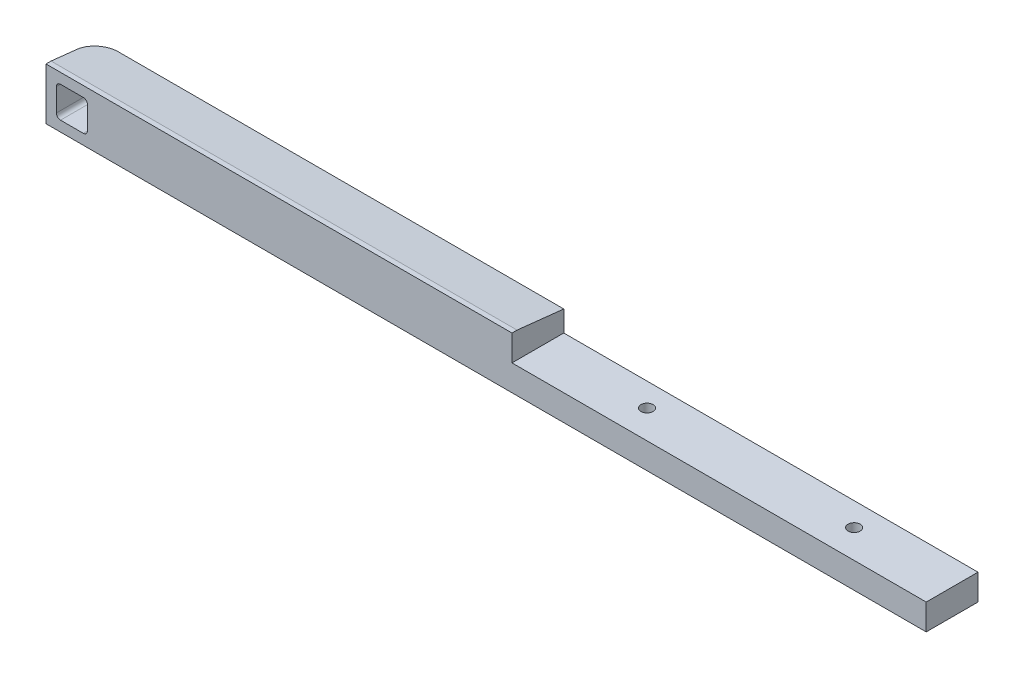
ISO-10303-21;
HEADER;
FILE_DESCRIPTION(('STEP AP214'),'2;1');
FILE_NAME('part.step','',(''),(''),'','','');
FILE_SCHEMA(('AUTOMOTIVE_DESIGN { 1 0 10303 214 1 1 1 1 }'));
ENDSEC;
DATA;
#1=APPLICATION_CONTEXT('core data for automotive mechanical design processes');
#2=APPLICATION_PROTOCOL_DEFINITION('international standard','automotive_design',2000,#1);
#3=PRODUCT_CONTEXT('',#1,'mechanical');
#4=PRODUCT('Part','Part','',(#3));
#5=PRODUCT_RELATED_PRODUCT_CATEGORY('part','',(#4));
#6=PRODUCT_DEFINITION_FORMATION('','',#4);
#7=PRODUCT_DEFINITION_CONTEXT('part definition',#1,'design');
#8=PRODUCT_DEFINITION('design','',#6,#7);
#9=PRODUCT_DEFINITION_SHAPE('','',#8);
#10=(LENGTH_UNIT() NAMED_UNIT(*) SI_UNIT(.MILLI.,.METRE.));
#11=(NAMED_UNIT(*) PLANE_ANGLE_UNIT() SI_UNIT($,.RADIAN.));
#12=(NAMED_UNIT(*) SI_UNIT($,.STERADIAN.) SOLID_ANGLE_UNIT());
#13=UNCERTAINTY_MEASURE_WITH_UNIT(LENGTH_MEASURE(1.E-05),#10,'distance_accuracy_value','');
#14=(GEOMETRIC_REPRESENTATION_CONTEXT(3) GLOBAL_UNCERTAINTY_ASSIGNED_CONTEXT((#13)) GLOBAL_UNIT_ASSIGNED_CONTEXT((#10,
#11,#12)) REPRESENTATION_CONTEXT('',''));
#15=CARTESIAN_POINT('',(0.,0.,0.));
#16=DIRECTION('',(0.,0.,1.));
#17=DIRECTION('',(1.,0.,0.));
#18=AXIS2_PLACEMENT_3D('',#15,#16,#17);
#19=CARTESIAN_POINT('',(195.886266753297,-328.191488077078,-130.629585564262));
#20=DIRECTION('',(0.,1.,0.));
#21=DIRECTION('',(0.,0.,1.));
#22=AXIS2_PLACEMENT_3D('',#19,#20,#21);
#23=CYLINDRICAL_SURFACE('',#22,1.75000000000001);
#24=CARTESIAN_POINT('',(195.886266753297,92.5,-130.629585564262));
#25=DIRECTION('',(0.,-1.,0.));
#26=DIRECTION('',(0.,0.,-1.));
#27=AXIS2_PLACEMENT_3D('',#24,#25,#26);
#28=CIRCLE('',#27,1.75000000000001);
#29=CARTESIAN_POINT('',(195.886266753297,92.5,-132.379585564262));
#30=VERTEX_POINT('',#29);
#31=EDGE_CURVE('E301',#30,#30,#28,.T.);
#32=ORIENTED_EDGE('',*,*,#31,.F.);
#33=EDGE_LOOP('',(#32));
#34=FACE_BOUND('',#33,.T.);
#35=CARTESIAN_POINT('',(195.886266753297,88.,-130.629585564262));
#36=DIRECTION('',(0.,-1.,0.));
#37=DIRECTION('',(0.,0.,-1.));
#38=AXIS2_PLACEMENT_3D('',#35,#36,#37);
#39=CIRCLE('',#38,1.75000000000001);
#40=CARTESIAN_POINT('',(195.886266753297,88.,-132.379585564262));
#41=VERTEX_POINT('',#40);
#42=EDGE_CURVE('E43',#41,#41,#39,.F.);
#43=ORIENTED_EDGE('',*,*,#42,.F.);
#44=EDGE_LOOP('',(#43));
#45=FACE_BOUND('',#44,.T.);
#46=ADVANCED_FACE('F39',(#34,#45),#23,.F.);
#47=CARTESIAN_POINT('',(135.886266753297,-328.191488077078,-130.629585564262));
#48=DIRECTION('',(0.,1.,0.));
#49=DIRECTION('',(0.,0.,1.));
#50=AXIS2_PLACEMENT_3D('',#47,#48,#49);
#51=CYLINDRICAL_SURFACE('',#50,1.75000000000001);
#52=CARTESIAN_POINT('',(135.886266753297,92.5,-130.629585564262));
#53=DIRECTION('',(0.,-1.,0.));
#54=DIRECTION('',(0.,0.,-1.));
#55=AXIS2_PLACEMENT_3D('',#52,#53,#54);
#56=CIRCLE('',#55,1.75000000000001);
#57=CARTESIAN_POINT('',(135.886266753297,92.5,-132.379585564262));
#58=VERTEX_POINT('',#57);
#59=EDGE_CURVE('E370',#58,#58,#56,.T.);
#60=ORIENTED_EDGE('',*,*,#59,.F.);
#61=EDGE_LOOP('',(#60));
#62=FACE_BOUND('',#61,.T.);
#63=CARTESIAN_POINT('',(135.886266753297,88.,-130.629585564262));
#64=DIRECTION('',(0.,-1.,0.));
#65=DIRECTION('',(0.,0.,-1.));
#66=AXIS2_PLACEMENT_3D('',#63,#64,#65);
#67=CIRCLE('',#66,1.75000000000001);
#68=CARTESIAN_POINT('',(135.886266753297,88.,-132.379585564262));
#69=VERTEX_POINT('',#68);
#70=EDGE_CURVE('E355',#69,#69,#67,.F.);
#71=ORIENTED_EDGE('',*,*,#70,.F.);
#72=EDGE_LOOP('',(#71));
#73=FACE_BOUND('',#72,.T.);
#74=ADVANCED_FACE('F549',(#62,#73),#51,.F.);
#75=CARTESIAN_POINT('',(225.,92.5,-137.41));
#76=DIRECTION('',(-1.,0.,0.));
#77=DIRECTION('',(0.,0.,1.));
#78=AXIS2_PLACEMENT_3D('',#75,#76,#77);
#79=PLANE('',#78);
#80=DIRECTION('',(0.,1.,0.));
#81=VECTOR('',#80,1.);
#82=CARTESIAN_POINT('',(225.,100.,-137.4));
#83=LINE('',#82,#81);
#84=CARTESIAN_POINT('',(225.,85.,-137.4));
#85=VERTEX_POINT('',#84);
#86=CARTESIAN_POINT('',(225.,92.5,-137.4));
#87=VERTEX_POINT('',#86);
#88=EDGE_CURVE('E525',#85,#87,#83,.T.);
#89=ORIENTED_EDGE('',*,*,#88,.T.);
#90=DIRECTION('',(0.,0.,1.));
#91=VECTOR('',#90,1.);
#92=CARTESIAN_POINT('',(225.,92.5,-137.41));
#93=LINE('',#92,#91);
#94=CARTESIAN_POINT('',(225.,92.5,-122.4));
#95=VERTEX_POINT('',#94);
#96=EDGE_CURVE('E11',#87,#95,#93,.T.);
#97=ORIENTED_EDGE('',*,*,#96,.T.);
#98=DIRECTION('',(0.,-1.,0.));
#99=VECTOR('',#98,1.);
#100=CARTESIAN_POINT('',(225.,100.,-122.4));
#101=LINE('',#100,#99);
#102=CARTESIAN_POINT('',(225.,85.,-122.4));
#103=VERTEX_POINT('',#102);
#104=EDGE_CURVE('E513',#95,#103,#101,.T.);
#105=ORIENTED_EDGE('',*,*,#104,.T.);
#106=DIRECTION('',(0.,0.,-1.));
#107=VECTOR('',#106,1.);
#108=CARTESIAN_POINT('',(225.,85.,-122.4));
#109=LINE('',#108,#107);
#110=EDGE_CURVE('E522',#103,#85,#109,.T.);
#111=ORIENTED_EDGE('',*,*,#110,.T.);
#112=EDGE_LOOP('',(#89,#97,#105,#111));
#113=FACE_BOUND('',#112,.T.);
#114=ADVANCED_FACE('F551',(#113),#79,.F.);
#115=CARTESIAN_POINT('',(105.,92.5,-137.41));
#116=DIRECTION('',(0.,-1.,0.));
#117=DIRECTION('',(0.,0.,-1.));
#118=AXIS2_PLACEMENT_3D('',#115,#116,#117);
#119=PLANE('',#118);
#120=ORIENTED_EDGE('',*,*,#31,.T.);
#121=EDGE_LOOP('',(#120));
#122=FACE_BOUND('',#121,.T.);
#123=ORIENTED_EDGE('',*,*,#59,.T.);
#124=EDGE_LOOP('',(#123));
#125=FACE_BOUND('',#124,.T.);
#126=DIRECTION('',(-1.,0.,0.));
#127=VECTOR('',#126,1.);
#128=CARTESIAN_POINT('',(381.213203435596,92.5,-137.4));
#129=LINE('',#128,#127);
#130=CARTESIAN_POINT('',(105.,92.5,-137.4));
#131=VERTEX_POINT('',#130);
#132=EDGE_CURVE('E535',#87,#131,#129,.T.);
#133=ORIENTED_EDGE('',*,*,#132,.T.);
#134=DIRECTION('',(0.,0.,1.));
#135=VECTOR('',#134,1.);
#136=CARTESIAN_POINT('',(105.,92.5,-137.41));
#137=LINE('',#136,#135);
#138=CARTESIAN_POINT('',(105.,92.5,-122.4));
#139=VERTEX_POINT('',#138);
#140=EDGE_CURVE('E49',#131,#139,#137,.T.);
#141=ORIENTED_EDGE('',*,*,#140,.T.);
#142=DIRECTION('',(1.,0.,0.));
#143=VECTOR('',#142,1.);
#144=CARTESIAN_POINT('',(381.213203435596,92.5,-122.4));
#145=LINE('',#144,#143);
#146=EDGE_CURVE('E517',#139,#95,#145,.T.);
#147=ORIENTED_EDGE('',*,*,#146,.T.);
#148=ORIENTED_EDGE('',*,*,#96,.F.);
#149=EDGE_LOOP('',(#133,#141,#147,#148));
#150=FACE_BOUND('',#149,.T.);
#151=ADVANCED_FACE('F558',(#122,#125,#150),#119,.F.);
#152=CARTESIAN_POINT('',(105.,100.,-137.41));
#153=DIRECTION('',(-1.,0.,0.));
#154=DIRECTION('',(0.,0.,1.));
#155=AXIS2_PLACEMENT_3D('',#152,#153,#154);
#156=PLANE('',#155);
#157=DIRECTION('',(0.,-1.,0.));
#158=VECTOR('',#157,1.);
#159=CARTESIAN_POINT('',(105.,100.,-122.4));
#160=LINE('',#159,#158);
#161=CARTESIAN_POINT('',(105.,100.,-122.4));
#162=VERTEX_POINT('',#161);
#163=EDGE_CURVE('E521',#162,#139,#160,.T.);
#164=ORIENTED_EDGE('',*,*,#163,.T.);
#165=ORIENTED_EDGE('',*,*,#140,.F.);
#166=DIRECTION('',(0.,1.,0.));
#167=VECTOR('',#166,1.);
#168=CARTESIAN_POINT('',(105.,100.,-137.4));
#169=LINE('',#168,#167);
#170=CARTESIAN_POINT('',(105.,98.5307773034513,-137.4));
#171=VERTEX_POINT('',#170);
#172=EDGE_CURVE('E527',#131,#171,#169,.T.);
#173=ORIENTED_EDGE('',*,*,#172,.T.);
#174=DIRECTION('',(0.,-0.107870042588919,-0.994165003363056));
#175=VECTOR('',#174,1.);
#176=CARTESIAN_POINT('',(105.,113.764620707969,3.));
#177=LINE('',#176,#175);
#178=CARTESIAN_POINT('',(105.,100.,-123.859171128524));
#179=VERTEX_POINT('',#178);
#180=EDGE_CURVE('E509',#179,#171,#177,.T.);
#181=ORIENTED_EDGE('',*,*,#180,.F.);
#182=DIRECTION('',(0.,0.,1.));
#183=VECTOR('',#182,1.);
#184=CARTESIAN_POINT('',(105.,100.,-122.4));
#185=LINE('',#184,#183);
#186=EDGE_CURVE('E512',#179,#162,#185,.T.);
#187=ORIENTED_EDGE('',*,*,#186,.T.);
#188=EDGE_LOOP('',(#164,#165,#173,#181,#187));
#189=FACE_BOUND('',#188,.T.);
#190=ADVANCED_FACE('F41',(#189),#156,.F.);
#191=CARTESIAN_POINT('',(-19.2,89.1999999999999,-132.4));
#192=DIRECTION('',(0.,0.,1.));
#193=DIRECTION('',(1.,0.,0.));
#194=AXIS2_PLACEMENT_3D('',#191,#192,#193);
#195=PLANE('',#194);
#196=CARTESIAN_POINT('',(-19.2,89.1999999999999,-132.4));
#197=DIRECTION('',(0.,0.,1.));
#198=DIRECTION('',(1.,0.,0.));
#199=AXIS2_PLACEMENT_3D('',#196,#197,#198);
#200=CIRCLE('',#199,1.19999999999999);
#201=CARTESIAN_POINT('',(-19.2,87.9999999999999,-132.4));
#202=VERTEX_POINT('',#201);
#203=CARTESIAN_POINT('',(-18.,89.1999999999999,-132.4));
#204=VERTEX_POINT('',#203);
#205=EDGE_CURVE('E375',#202,#204,#200,.T.);
#206=ORIENTED_EDGE('',*,*,#205,.T.);
#207=DIRECTION('',(0.,1.,0.));
#208=VECTOR('',#207,1.);
#209=CARTESIAN_POINT('',(-18.,89.1999999999999,-132.4));
#210=LINE('',#209,#208);
#211=CARTESIAN_POINT('',(-18.,95.7999999999999,-132.4));
#212=VERTEX_POINT('',#211);
#213=EDGE_CURVE('E379',#204,#212,#210,.T.);
#214=ORIENTED_EDGE('',*,*,#213,.T.);
#215=CARTESIAN_POINT('',(-19.2,95.7999999999999,-132.4));
#216=DIRECTION('',(0.,0.,1.));
#217=DIRECTION('',(1.,0.,0.));
#218=AXIS2_PLACEMENT_3D('',#215,#216,#217);
#219=CIRCLE('',#218,1.20000000000001);
#220=CARTESIAN_POINT('',(-19.2,96.9999999999999,-132.4));
#221=VERTEX_POINT('',#220);
#222=EDGE_CURVE('E384',#212,#221,#219,.T.);
#223=ORIENTED_EDGE('',*,*,#222,.T.);
#224=DIRECTION('',(-1.,0.,0.));
#225=VECTOR('',#224,1.);
#226=CARTESIAN_POINT('',(-19.2,96.9999999999999,-132.4));
#227=LINE('',#226,#225);
#228=CARTESIAN_POINT('',(-25.8,96.9999999999999,-132.4));
#229=VERTEX_POINT('',#228);
#230=EDGE_CURVE('E388',#221,#229,#227,.T.);
#231=ORIENTED_EDGE('',*,*,#230,.T.);
#232=CARTESIAN_POINT('',(-25.8,95.7999999999999,-132.4));
#233=DIRECTION('',(0.,0.,1.));
#234=DIRECTION('',(1.,0.,0.));
#235=AXIS2_PLACEMENT_3D('',#232,#233,#234);
#236=CIRCLE('',#235,1.20000000000002);
#237=CARTESIAN_POINT('',(-27.,95.7999999999999,-132.4));
#238=VERTEX_POINT('',#237);
#239=EDGE_CURVE('E392',#229,#238,#236,.T.);
#240=ORIENTED_EDGE('',*,*,#239,.T.);
#241=DIRECTION('',(0.,-1.,0.));
#242=VECTOR('',#241,1.);
#243=CARTESIAN_POINT('',(-27.,95.7999999999999,-132.4));
#244=LINE('',#243,#242);
#245=CARTESIAN_POINT('',(-27.,89.1999999999999,-132.4));
#246=VERTEX_POINT('',#245);
#247=EDGE_CURVE('E396',#238,#246,#244,.T.);
#248=ORIENTED_EDGE('',*,*,#247,.T.);
#249=CARTESIAN_POINT('',(-25.8,89.1999999999999,-132.4));
#250=DIRECTION('',(0.,0.,1.));
#251=DIRECTION('',(1.,0.,0.));
#252=AXIS2_PLACEMENT_3D('',#249,#250,#251);
#253=CIRCLE('',#252,1.19999999999999);
#254=CARTESIAN_POINT('',(-25.8,87.9999999999999,-132.4));
#255=VERTEX_POINT('',#254);
#256=EDGE_CURVE('E400',#246,#255,#253,.T.);
#257=ORIENTED_EDGE('',*,*,#256,.T.);
#258=DIRECTION('',(1.,0.,0.));
#259=VECTOR('',#258,1.);
#260=CARTESIAN_POINT('',(-25.8,87.9999999999999,-132.4));
#261=LINE('',#260,#259);
#262=EDGE_CURVE('E404',#255,#202,#261,.T.);
#263=ORIENTED_EDGE('',*,*,#262,.T.);
#264=EDGE_LOOP('',(#206,#214,#223,#231,#240,#248,#257,#263));
#265=FACE_BOUND('',#264,.T.);
#266=ADVANCED_FACE('F568',(#265),#195,.T.);
#267=CARTESIAN_POINT('',(-18.,89.1999999999999,-132.4));
#268=DIRECTION('',(1.,0.,0.));
#269=DIRECTION('',(0.,1.,0.));
#270=AXIS2_PLACEMENT_3D('',#267,#268,#269);
#271=PLANE('',#270);
#272=DIRECTION('',(0.,1.,0.));
#273=VECTOR('',#272,1.);
#274=CARTESIAN_POINT('',(-18.,89.1999999999999,-122.4));
#275=LINE('',#274,#273);
#276=CARTESIAN_POINT('',(-18.,89.1999999999999,-122.4));
#277=VERTEX_POINT('',#276);
#278=CARTESIAN_POINT('',(-18.,95.7999999999999,-122.4));
#279=VERTEX_POINT('',#278);
#280=EDGE_CURVE('E411',#277,#279,#275,.T.);
#281=ORIENTED_EDGE('',*,*,#280,.T.);
#282=DIRECTION('',(0.,0.,1.));
#283=VECTOR('',#282,1.);
#284=CARTESIAN_POINT('',(-18.,95.7999999999999,-132.4));
#285=LINE('',#284,#283);
#286=EDGE_CURVE('E457',#212,#279,#285,.T.);
#287=ORIENTED_EDGE('',*,*,#286,.F.);
#288=ORIENTED_EDGE('',*,*,#213,.F.);
#289=DIRECTION('',(0.,0.,1.));
#290=VECTOR('',#289,1.);
#291=CARTESIAN_POINT('',(-18.,89.1999999999999,-132.4));
#292=LINE('',#291,#290);
#293=EDGE_CURVE('E408',#204,#277,#292,.T.);
#294=ORIENTED_EDGE('',*,*,#293,.T.);
#295=EDGE_LOOP('',(#281,#287,#288,#294));
#296=FACE_BOUND('',#295,.T.);
#297=ADVANCED_FACE('F571',(#296),#271,.F.);
#298=CARTESIAN_POINT('',(-19.2,95.7999999999999,-132.4));
#299=DIRECTION('',(0.,0.,1.));
#300=DIRECTION('',(1.,0.,0.));
#301=AXIS2_PLACEMENT_3D('',#298,#299,#300);
#302=CYLINDRICAL_SURFACE('',#301,1.20000000000001);
#303=CARTESIAN_POINT('',(-19.2,95.7999999999999,-122.4));
#304=DIRECTION('',(0.,0.,1.));
#305=DIRECTION('',(1.,0.,0.));
#306=AXIS2_PLACEMENT_3D('',#303,#304,#305);
#307=CIRCLE('',#306,1.20000000000001);
#308=CARTESIAN_POINT('',(-19.2,96.9999999999999,-122.4));
#309=VERTEX_POINT('',#308);
#310=EDGE_CURVE('E415',#279,#309,#307,.T.);
#311=ORIENTED_EDGE('',*,*,#310,.T.);
#312=DIRECTION('',(0.,0.,1.));
#313=VECTOR('',#312,1.);
#314=CARTESIAN_POINT('',(-19.2,96.9999999999999,-132.4));
#315=LINE('',#314,#313);
#316=EDGE_CURVE('E454',#221,#309,#315,.T.);
#317=ORIENTED_EDGE('',*,*,#316,.F.);
#318=ORIENTED_EDGE('',*,*,#222,.F.);
#319=ORIENTED_EDGE('',*,*,#286,.T.);
#320=EDGE_LOOP('',(#311,#317,#318,#319));
#321=FACE_BOUND('',#320,.T.);
#322=ADVANCED_FACE('F593',(#321),#302,.F.);
#323=CARTESIAN_POINT('',(-19.2,96.9999999999999,-132.4));
#324=DIRECTION('',(0.,1.,0.));
#325=DIRECTION('',(0.,0.,1.));
#326=AXIS2_PLACEMENT_3D('',#323,#324,#325);
#327=PLANE('',#326);
#328=DIRECTION('',(-1.,0.,0.));
#329=VECTOR('',#328,1.);
#330=CARTESIAN_POINT('',(-19.2,96.9999999999999,-122.4));
#331=LINE('',#330,#329);
#332=CARTESIAN_POINT('',(-25.8,96.9999999999999,-122.4));
#333=VERTEX_POINT('',#332);
#334=EDGE_CURVE('E419',#309,#333,#331,.T.);
#335=ORIENTED_EDGE('',*,*,#334,.T.);
#336=DIRECTION('',(0.,0.,1.));
#337=VECTOR('',#336,1.);
#338=CARTESIAN_POINT('',(-25.8,96.9999999999999,-132.4));
#339=LINE('',#338,#337);
#340=EDGE_CURVE('E451',#229,#333,#339,.T.);
#341=ORIENTED_EDGE('',*,*,#340,.F.);
#342=ORIENTED_EDGE('',*,*,#230,.F.);
#343=ORIENTED_EDGE('',*,*,#316,.T.);
#344=EDGE_LOOP('',(#335,#341,#342,#343));
#345=FACE_BOUND('',#344,.T.);
#346=ADVANCED_FACE('F589',(#345),#327,.F.);
#347=CARTESIAN_POINT('',(-25.8,95.7999999999999,-132.4));
#348=DIRECTION('',(0.,0.,1.));
#349=DIRECTION('',(1.,0.,0.));
#350=AXIS2_PLACEMENT_3D('',#347,#348,#349);
#351=CYLINDRICAL_SURFACE('',#350,1.20000000000002);
#352=CARTESIAN_POINT('',(-25.8,95.7999999999999,-122.4));
#353=DIRECTION('',(0.,0.,1.));
#354=DIRECTION('',(1.,0.,0.));
#355=AXIS2_PLACEMENT_3D('',#352,#353,#354);
#356=CIRCLE('',#355,1.20000000000002);
#357=CARTESIAN_POINT('',(-27.,95.7999999999999,-122.4));
#358=VERTEX_POINT('',#357);
#359=EDGE_CURVE('E423',#333,#358,#356,.T.);
#360=ORIENTED_EDGE('',*,*,#359,.T.);
#361=DIRECTION('',(0.,0.,1.));
#362=VECTOR('',#361,1.);
#363=CARTESIAN_POINT('',(-27.,95.7999999999999,-132.4));
#364=LINE('',#363,#362);
#365=EDGE_CURVE('E448',#238,#358,#364,.T.);
#366=ORIENTED_EDGE('',*,*,#365,.F.);
#367=ORIENTED_EDGE('',*,*,#239,.F.);
#368=ORIENTED_EDGE('',*,*,#340,.T.);
#369=EDGE_LOOP('',(#360,#366,#367,#368));
#370=FACE_BOUND('',#369,.T.);
#371=ADVANCED_FACE('F585',(#370),#351,.F.);
#372=CARTESIAN_POINT('',(-27.,95.7999999999999,-132.4));
#373=DIRECTION('',(-1.,0.,0.));
#374=DIRECTION('',(0.,-1.,0.));
#375=AXIS2_PLACEMENT_3D('',#372,#373,#374);
#376=PLANE('',#375);
#377=DIRECTION('',(0.,-1.,0.));
#378=VECTOR('',#377,1.);
#379=CARTESIAN_POINT('',(-27.,95.7999999999999,-122.4));
#380=LINE('',#379,#378);
#381=CARTESIAN_POINT('',(-27.,89.1999999999999,-122.4));
#382=VERTEX_POINT('',#381);
#383=EDGE_CURVE('E427',#358,#382,#380,.T.);
#384=ORIENTED_EDGE('',*,*,#383,.T.);
#385=DIRECTION('',(0.,0.,1.));
#386=VECTOR('',#385,1.);
#387=CARTESIAN_POINT('',(-27.,89.1999999999999,-132.4));
#388=LINE('',#387,#386);
#389=EDGE_CURVE('E445',#246,#382,#388,.T.);
#390=ORIENTED_EDGE('',*,*,#389,.F.);
#391=ORIENTED_EDGE('',*,*,#247,.F.);
#392=ORIENTED_EDGE('',*,*,#365,.T.);
#393=EDGE_LOOP('',(#384,#390,#391,#392));
#394=FACE_BOUND('',#393,.T.);
#395=ADVANCED_FACE('F581',(#394),#376,.F.);
#396=CARTESIAN_POINT('',(-25.8,89.1999999999999,-132.4));
#397=DIRECTION('',(0.,0.,1.));
#398=DIRECTION('',(1.,0.,0.));
#399=AXIS2_PLACEMENT_3D('',#396,#397,#398);
#400=CYLINDRICAL_SURFACE('',#399,1.19999999999999);
#401=CARTESIAN_POINT('',(-25.8,89.1999999999999,-122.4));
#402=DIRECTION('',(0.,0.,1.));
#403=DIRECTION('',(1.,0.,0.));
#404=AXIS2_PLACEMENT_3D('',#401,#402,#403);
#405=CIRCLE('',#404,1.19999999999999);
#406=CARTESIAN_POINT('',(-25.8,87.9999999999999,-122.4));
#407=VERTEX_POINT('',#406);
#408=EDGE_CURVE('E431',#382,#407,#405,.T.);
#409=ORIENTED_EDGE('',*,*,#408,.T.);
#410=DIRECTION('',(0.,0.,1.));
#411=VECTOR('',#410,1.);
#412=CARTESIAN_POINT('',(-25.8,87.9999999999999,-132.4));
#413=LINE('',#412,#411);
#414=EDGE_CURVE('E442',#255,#407,#413,.T.);
#415=ORIENTED_EDGE('',*,*,#414,.F.);
#416=ORIENTED_EDGE('',*,*,#256,.F.);
#417=ORIENTED_EDGE('',*,*,#389,.T.);
#418=EDGE_LOOP('',(#409,#415,#416,#417));
#419=FACE_BOUND('',#418,.T.);
#420=ADVANCED_FACE('F577',(#419),#400,.F.);
#421=CARTESIAN_POINT('',(-25.8,87.9999999999999,-132.4));
#422=DIRECTION('',(0.,-1.,0.));
#423=DIRECTION('',(0.,0.,-1.));
#424=AXIS2_PLACEMENT_3D('',#421,#422,#423);
#425=PLANE('',#424);
#426=DIRECTION('',(1.,0.,0.));
#427=VECTOR('',#426,1.);
#428=CARTESIAN_POINT('',(-25.8,87.9999999999999,-122.4));
#429=LINE('',#428,#427);
#430=CARTESIAN_POINT('',(-19.2,87.9999999999999,-122.4));
#431=VERTEX_POINT('',#430);
#432=EDGE_CURVE('E380',#407,#431,#429,.T.);
#433=ORIENTED_EDGE('',*,*,#432,.T.);
#434=DIRECTION('',(0.,0.,1.));
#435=VECTOR('',#434,1.);
#436=CARTESIAN_POINT('',(-19.2,87.9999999999999,-132.4));
#437=LINE('',#436,#435);
#438=EDGE_CURVE('E438',#202,#431,#437,.T.);
#439=ORIENTED_EDGE('',*,*,#438,.F.);
#440=ORIENTED_EDGE('',*,*,#262,.F.);
#441=ORIENTED_EDGE('',*,*,#414,.T.);
#442=EDGE_LOOP('',(#433,#439,#440,#441));
#443=FACE_BOUND('',#442,.T.);
#444=ADVANCED_FACE('F573',(#443),#425,.F.);
#445=CARTESIAN_POINT('',(-19.2,89.1999999999999,-132.4));
#446=DIRECTION('',(0.,0.,1.));
#447=DIRECTION('',(1.,0.,0.));
#448=AXIS2_PLACEMENT_3D('',#445,#446,#447);
#449=CYLINDRICAL_SURFACE('',#448,1.19999999999999);
#450=CARTESIAN_POINT('',(-19.2,89.1999999999999,-122.4));
#451=DIRECTION('',(0.,0.,1.));
#452=DIRECTION('',(1.,0.,0.));
#453=AXIS2_PLACEMENT_3D('',#450,#451,#452);
#454=CIRCLE('',#453,1.19999999999999);
#455=EDGE_CURVE('E374',#431,#277,#454,.T.);
#456=ORIENTED_EDGE('',*,*,#455,.T.);
#457=ORIENTED_EDGE('',*,*,#293,.F.);
#458=ORIENTED_EDGE('',*,*,#205,.F.);
#459=ORIENTED_EDGE('',*,*,#438,.T.);
#460=EDGE_LOOP('',(#456,#457,#458,#459));
#461=FACE_BOUND('',#460,.T.);
#462=ADVANCED_FACE('F576',(#461),#449,.F.);
#463=CARTESIAN_POINT('',(381.213203435596,85.,-122.4));
#464=DIRECTION('',(0.,-1.,0.));
#465=DIRECTION('',(0.,0.,-1.));
#466=AXIS2_PLACEMENT_3D('',#463,#464,#465);
#467=PLANE('',#466);
#468=DIRECTION('',(0.500000000000001,0.,0.866025403784438));
#469=VECTOR('',#468,1.);
#470=CARTESIAN_POINT('',(248.37959221586,85.,-45.7084788048546));
#471=LINE('',#470,#469);
#472=CARTESIAN_POINT('',(197.618317560866,85.,-133.629585564262));
#473=VERTEX_POINT('',#472);
#474=CARTESIAN_POINT('',(199.350368368434,85.,-130.629585564261));
#475=VERTEX_POINT('',#474);
#476=EDGE_CURVE('E57',#473,#475,#471,.T.);
#477=ORIENTED_EDGE('',*,*,#476,.F.);
#478=DIRECTION('',(1.,0.,0.));
#479=VECTOR('',#478,1.);
#480=CARTESIAN_POINT('',(381.213203435596,85.,-133.629585564262));
#481=LINE('',#480,#479);
#482=CARTESIAN_POINT('',(194.154215945728,85.,-133.629585564262));
#483=VERTEX_POINT('',#482);
#484=EDGE_CURVE('E252',#483,#473,#481,.T.);
#485=ORIENTED_EDGE('',*,*,#484,.F.);
#486=DIRECTION('',(0.500000000000001,0.,-0.866025403784438));
#487=VECTOR('',#486,1.);
#488=CARTESIAN_POINT('',(236.056409631885,85.,-206.206313977276));
#489=LINE('',#488,#487);
#490=CARTESIAN_POINT('',(192.422165138159,85.,-130.629585564262));
#491=VERTEX_POINT('',#490);
#492=EDGE_CURVE('E257',#491,#483,#489,.T.);
#493=ORIENTED_EDGE('',*,*,#492,.F.);
#494=DIRECTION('',(-0.500000000000001,0.,-0.866025403784438));
#495=VECTOR('',#494,1.);
#496=CARTESIAN_POINT('',(243.183439793153,85.,-42.7084788048546));
#497=LINE('',#496,#495);
#498=CARTESIAN_POINT('',(194.154215945728,85.,-127.629585564262));
#499=VERTEX_POINT('',#498);
#500=EDGE_CURVE('E280',#499,#491,#497,.T.);
#501=ORIENTED_EDGE('',*,*,#500,.F.);
#502=DIRECTION('',(-1.,0.,0.));
#503=VECTOR('',#502,1.);
#504=CARTESIAN_POINT('',(381.213203435596,85.,-127.629585564262));
#505=LINE('',#504,#503);
#506=CARTESIAN_POINT('',(197.618317560865,85.,-127.629585564262));
#507=VERTEX_POINT('',#506);
#508=EDGE_CURVE('E276',#507,#499,#505,.T.);
#509=ORIENTED_EDGE('',*,*,#508,.F.);
#510=DIRECTION('',(-0.500000000000001,0.,0.866025403784438));
#511=VECTOR('',#510,1.);
#512=CARTESIAN_POINT('',(241.252562054591,85.,-203.206313977276));
#513=LINE('',#512,#511);
#514=EDGE_CURVE('E273',#475,#507,#513,.T.);
#515=ORIENTED_EDGE('',*,*,#514,.F.);
#516=EDGE_LOOP('',(#477,#485,#493,#501,#509,#515));
#517=FACE_BOUND('',#516,.T.);
#518=DIRECTION('',(0.500000000000001,0.,0.866025403784438));
#519=VECTOR('',#518,1.);
#520=CARTESIAN_POINT('',(203.37959221586,85.,-19.7277166913214));
#521=LINE('',#520,#519);
#522=CARTESIAN_POINT('',(137.618317560866,85.,-133.629585564262));
#523=VERTEX_POINT('',#522);
#524=CARTESIAN_POINT('',(139.350368368434,85.,-130.629585564261));
#525=VERTEX_POINT('',#524);
#526=EDGE_CURVE('E65',#523,#525,#521,.T.);
#527=ORIENTED_EDGE('',*,*,#526,.F.);
#528=DIRECTION('',(1.,0.,0.));
#529=VECTOR('',#528,1.);
#530=CARTESIAN_POINT('',(381.213203435596,85.,-133.629585564262));
#531=LINE('',#530,#529);
#532=CARTESIAN_POINT('',(134.154215945728,85.,-133.629585564262));
#533=VERTEX_POINT('',#532);
#534=EDGE_CURVE('E310',#533,#523,#531,.T.);
#535=ORIENTED_EDGE('',*,*,#534,.F.);
#536=DIRECTION('',(0.500000000000001,0.,-0.866025403784438));
#537=VECTOR('',#536,1.);
#538=CARTESIAN_POINT('',(191.056409631885,85.,-232.18707609081));
#539=LINE('',#538,#537);
#540=CARTESIAN_POINT('',(132.422165138159,85.,-130.629585564262));
#541=VERTEX_POINT('',#540);
#542=EDGE_CURVE('E345',#541,#533,#539,.T.);
#543=ORIENTED_EDGE('',*,*,#542,.F.);
#544=DIRECTION('',(-0.500000000000001,0.,-0.866025403784438));
#545=VECTOR('',#544,1.);
#546=CARTESIAN_POINT('',(198.183439793153,85.,-16.7277166913214));
#547=LINE('',#546,#545);
#548=CARTESIAN_POINT('',(134.154215945728,85.,-127.629585564262));
#549=VERTEX_POINT('',#548);
#550=EDGE_CURVE('E341',#549,#541,#547,.T.);
#551=ORIENTED_EDGE('',*,*,#550,.F.);
#552=DIRECTION('',(-1.,0.,0.));
#553=VECTOR('',#552,1.);
#554=CARTESIAN_POINT('',(381.213203435596,85.,-127.629585564262));
#555=LINE('',#554,#553);
#556=CARTESIAN_POINT('',(137.618317560865,85.,-127.629585564262));
#557=VERTEX_POINT('',#556);
#558=EDGE_CURVE('E337',#557,#549,#555,.T.);
#559=ORIENTED_EDGE('',*,*,#558,.F.);
#560=DIRECTION('',(-0.500000000000001,0.,0.866025403784438));
#561=VECTOR('',#560,1.);
#562=CARTESIAN_POINT('',(196.252562054591,85.,-229.18707609081));
#563=LINE('',#562,#561);
#564=EDGE_CURVE('E333',#525,#557,#563,.T.);
#565=ORIENTED_EDGE('',*,*,#564,.F.);
#566=EDGE_LOOP('',(#527,#535,#543,#551,#559,#565));
#567=FACE_BOUND('',#566,.T.);
#568=ORIENTED_EDGE('',*,*,#110,.F.);
#569=DIRECTION('',(-1.,0.,0.));
#570=VECTOR('',#569,1.);
#571=CARTESIAN_POINT('',(381.213203435596,85.,-122.4));
#572=LINE('',#571,#570);
#573=CARTESIAN_POINT('',(-30.,85.,-122.4));
#574=VERTEX_POINT('',#573);
#575=EDGE_CURVE('E490',#103,#574,#572,.T.);
#576=ORIENTED_EDGE('',*,*,#575,.T.);
#577=DIRECTION('',(0.,0.,1.));
#578=VECTOR('',#577,1.);
#579=CARTESIAN_POINT('',(-30.,85.,-122.4));
#580=LINE('',#579,#578);
#581=CARTESIAN_POINT('',(-30.,85.,-131.4));
#582=VERTEX_POINT('',#581);
#583=EDGE_CURVE('E478',#582,#574,#580,.T.);
#584=ORIENTED_EDGE('',*,*,#583,.F.);
#585=CARTESIAN_POINT('',(-24.,85.,-131.4));
#586=DIRECTION('',(0.,-1.,0.));
#587=DIRECTION('',(0.,0.,-1.));
#588=AXIS2_PLACEMENT_3D('',#585,#586,#587);
#589=CIRCLE('',#588,6.);
#590=CARTESIAN_POINT('',(-24.,85.,-137.4));
#591=VERTEX_POINT('',#590);
#592=EDGE_CURVE('E501',#582,#591,#589,.T.);
#593=ORIENTED_EDGE('',*,*,#592,.T.);
#594=DIRECTION('',(-1.,0.,0.));
#595=VECTOR('',#594,1.);
#596=CARTESIAN_POINT('',(381.213203435596,85.,-137.4));
#597=LINE('',#596,#595);
#598=EDGE_CURVE('E482',#85,#591,#597,.T.);
#599=ORIENTED_EDGE('',*,*,#598,.F.);
#600=EDGE_LOOP('',(#568,#576,#584,#593,#599));
#601=FACE_BOUND('',#600,.T.);
#602=ADVANCED_FACE('F603',(#517,#567,#601),#467,.T.);
#603=CARTESIAN_POINT('',(-30.,0.,0.));
#604=DIRECTION('',(1.,0.,0.));
#605=DIRECTION('',(0.,0.,-1.));
#606=AXIS2_PLACEMENT_3D('',#603,#604,#605);
#607=PLANE('',#606);
#608=DIRECTION('',(0.,0.,-1.));
#609=VECTOR('',#608,1.);
#610=CARTESIAN_POINT('',(-30.,100.,-122.4));
#611=LINE('',#610,#609);
#612=CARTESIAN_POINT('',(-30.,100.,-122.4));
#613=VERTEX_POINT('',#612);
#614=CARTESIAN_POINT('',(-30.,100.,-123.859171128524));
#615=VERTEX_POINT('',#614);
#616=EDGE_CURVE('E483',#613,#615,#611,.T.);
#617=ORIENTED_EDGE('',*,*,#616,.T.);
#618=DIRECTION('',(0.,-0.107870042588919,-0.994165003363056));
#619=VECTOR('',#618,1.);
#620=CARTESIAN_POINT('',(-30.,112.119139850914,-12.1652807630912));
#621=LINE('',#620,#619);
#622=CARTESIAN_POINT('',(-30.,99.1817962523623,-131.4));
#623=VERTEX_POINT('',#622);
#624=EDGE_CURVE('E470',#615,#623,#621,.T.);
#625=ORIENTED_EDGE('',*,*,#624,.T.);
#626=DIRECTION('',(0.,-1.,0.));
#627=VECTOR('',#626,1.);
#628=CARTESIAN_POINT('',(-30.,85.,-131.4));
#629=LINE('',#628,#627);
#630=EDGE_CURVE('E498',#623,#582,#629,.T.);
#631=ORIENTED_EDGE('',*,*,#630,.T.);
#632=ORIENTED_EDGE('',*,*,#583,.T.);
#633=DIRECTION('',(0.,1.,0.));
#634=VECTOR('',#633,1.);
#635=CARTESIAN_POINT('',(-30.,100.,-122.4));
#636=LINE('',#635,#634);
#637=EDGE_CURVE('E477',#574,#613,#636,.T.);
#638=ORIENTED_EDGE('',*,*,#637,.T.);
#639=EDGE_LOOP('',(#617,#625,#631,#632,#638));
#640=FACE_BOUND('',#639,.T.);
#641=ADVANCED_FACE('F611',(#640),#607,.F.);
#642=CARTESIAN_POINT('',(-24.,0.,-131.4));
#643=DIRECTION('',(0.,1.,0.));
#644=DIRECTION('',(0.,0.,1.));
#645=AXIS2_PLACEMENT_3D('',#642,#643,#644);
#646=CYLINDRICAL_SURFACE('',#645,6.);
#647=CARTESIAN_POINT('',(-24.,99.1817962523623,-131.4));
#648=DIRECTION('',(0.,-0.994165003363056,0.107870042588919));
#649=DIRECTION('',(0.,0.107870042588919,0.994165003363056));
#650=AXIS2_PLACEMENT_3D('',#647,#648,#649);
#651=ELLIPSE('',#650,6.03521546192356,6.);
#652=CARTESIAN_POINT('',(-24.,98.5307773034513,-137.4));
#653=VERTEX_POINT('',#652);
#654=EDGE_CURVE('E474',#653,#623,#651,.F.);
#655=ORIENTED_EDGE('',*,*,#654,.F.);
#656=DIRECTION('',(0.,-1.,0.));
#657=VECTOR('',#656,1.);
#658=CARTESIAN_POINT('',(-24.,100.,-137.4));
#659=LINE('',#658,#657);
#660=EDGE_CURVE('E505',#591,#653,#659,.F.);
#661=ORIENTED_EDGE('',*,*,#660,.F.);
#662=ORIENTED_EDGE('',*,*,#592,.F.);
#663=ORIENTED_EDGE('',*,*,#630,.F.);
#664=EDGE_LOOP('',(#655,#661,#662,#663));
#665=FACE_BOUND('',#664,.T.);
#666=ADVANCED_FACE('F614',(#665),#646,.T.);
#667=CARTESIAN_POINT('',(381.213203435596,100.,-137.4));
#668=DIRECTION('',(0.,0.,-1.));
#669=DIRECTION('',(-1.,0.,0.));
#670=AXIS2_PLACEMENT_3D('',#667,#668,#669);
#671=PLANE('',#670);
#672=ORIENTED_EDGE('',*,*,#172,.F.);
#673=ORIENTED_EDGE('',*,*,#132,.F.);
#674=ORIENTED_EDGE('',*,*,#88,.F.);
#675=ORIENTED_EDGE('',*,*,#598,.T.);
#676=ORIENTED_EDGE('',*,*,#660,.T.);
#677=DIRECTION('',(1.,0.,0.));
#678=VECTOR('',#677,1.);
#679=CARTESIAN_POINT('',(-32.0005,98.5307773034513,-137.4));
#680=LINE('',#679,#678);
#681=EDGE_CURVE('E441',#653,#171,#680,.T.);
#682=ORIENTED_EDGE('',*,*,#681,.T.);
#683=EDGE_LOOP('',(#672,#673,#674,#675,#676,#682));
#684=FACE_BOUND('',#683,.T.);
#685=ADVANCED_FACE('F622',(#684),#671,.T.);
#686=CARTESIAN_POINT('',(381.213203435596,100.,-122.4));
#687=DIRECTION('',(0.,1.,0.));
#688=DIRECTION('',(0.,0.,1.));
#689=AXIS2_PLACEMENT_3D('',#686,#687,#688);
#690=PLANE('',#689);
#691=ORIENTED_EDGE('',*,*,#186,.F.);
#692=DIRECTION('',(1.,0.,0.));
#693=VECTOR('',#692,1.);
#694=CARTESIAN_POINT('',(381.213203435596,100.,-123.859171128524));
#695=LINE('',#694,#693);
#696=EDGE_CURVE('E466',#615,#179,#695,.T.);
#697=ORIENTED_EDGE('',*,*,#696,.F.);
#698=ORIENTED_EDGE('',*,*,#616,.F.);
#699=DIRECTION('',(-1.,0.,0.));
#700=VECTOR('',#699,1.);
#701=CARTESIAN_POINT('',(381.213203435596,100.,-122.4));
#702=LINE('',#701,#700);
#703=EDGE_CURVE('E493',#162,#613,#702,.T.);
#704=ORIENTED_EDGE('',*,*,#703,.F.);
#705=EDGE_LOOP('',(#691,#697,#698,#704));
#706=FACE_BOUND('',#705,.T.);
#707=ADVANCED_FACE('F609',(#706),#690,.T.);
#708=CARTESIAN_POINT('',(-32.0005,113.764620707969,3.));
#709=DIRECTION('',(0.,-0.994165003363056,0.107870042588919));
#710=DIRECTION('',(0.,-0.107870042588919,-0.994165003363056));
#711=AXIS2_PLACEMENT_3D('',#708,#709,#710);
#712=PLANE('',#711);
#713=ORIENTED_EDGE('',*,*,#696,.T.);
#714=ORIENTED_EDGE('',*,*,#180,.T.);
#715=ORIENTED_EDGE('',*,*,#681,.F.);
#716=ORIENTED_EDGE('',*,*,#654,.T.);
#717=ORIENTED_EDGE('',*,*,#624,.F.);
#718=EDGE_LOOP('',(#713,#714,#715,#716,#717));
#719=FACE_BOUND('',#718,.T.);
#720=ADVANCED_FACE('F605',(#719),#712,.F.);
#721=CARTESIAN_POINT('',(381.213203435596,100.,-122.4));
#722=DIRECTION('',(0.,0.,1.));
#723=DIRECTION('',(0.,-1.,0.));
#724=AXIS2_PLACEMENT_3D('',#721,#722,#723);
#725=PLANE('',#724);
#726=ORIENTED_EDGE('',*,*,#163,.F.);
#727=ORIENTED_EDGE('',*,*,#703,.T.);
#728=ORIENTED_EDGE('',*,*,#637,.F.);
#729=ORIENTED_EDGE('',*,*,#575,.F.);
#730=ORIENTED_EDGE('',*,*,#104,.F.);
#731=ORIENTED_EDGE('',*,*,#146,.F.);
#732=EDGE_LOOP('',(#726,#727,#728,#729,#730,#731));
#733=FACE_BOUND('',#732,.T.);
#734=ORIENTED_EDGE('',*,*,#455,.F.);
#735=ORIENTED_EDGE('',*,*,#432,.F.);
#736=ORIENTED_EDGE('',*,*,#408,.F.);
#737=ORIENTED_EDGE('',*,*,#383,.F.);
#738=ORIENTED_EDGE('',*,*,#359,.F.);
#739=ORIENTED_EDGE('',*,*,#334,.F.);
#740=ORIENTED_EDGE('',*,*,#310,.F.);
#741=ORIENTED_EDGE('',*,*,#280,.F.);
#742=EDGE_LOOP('',(#734,#735,#736,#737,#738,#739,#740,#741));
#743=FACE_BOUND('',#742,.T.);
#744=ADVANCED_FACE('F608',(#733,#743),#725,.T.);
#745=CARTESIAN_POINT('',(0.,88.,0.));
#746=DIRECTION('',(0.,-1.,0.));
#747=DIRECTION('',(0.,0.,-1.));
#748=AXIS2_PLACEMENT_3D('',#745,#746,#747);
#749=PLANE('',#748);
#750=DIRECTION('',(0.500000000000001,0.,0.866025403784438));
#751=VECTOR('',#750,1.);
#752=CARTESIAN_POINT('',(203.37959221586,88.,-19.7277166913214));
#753=LINE('',#752,#751);
#754=CARTESIAN_POINT('',(137.618317560866,88.,-133.629585564262));
#755=VERTEX_POINT('',#754);
#756=CARTESIAN_POINT('',(139.350368368434,88.,-130.629585564261));
#757=VERTEX_POINT('',#756);
#758=EDGE_CURVE('E305',#755,#757,#753,.T.);
#759=ORIENTED_EDGE('',*,*,#758,.T.);
#760=DIRECTION('',(-0.500000000000001,0.,0.866025403784438));
#761=VECTOR('',#760,1.);
#762=CARTESIAN_POINT('',(196.252562054591,88.,-229.18707609081));
#763=LINE('',#762,#761);
#764=CARTESIAN_POINT('',(137.618317560865,88.,-127.629585564262));
#765=VERTEX_POINT('',#764);
#766=EDGE_CURVE('E309',#757,#765,#763,.T.);
#767=ORIENTED_EDGE('',*,*,#766,.T.);
#768=DIRECTION('',(-1.,0.,0.));
#769=VECTOR('',#768,1.);
#770=CARTESIAN_POINT('',(381.213203435596,88.,-127.629585564262));
#771=LINE('',#770,#769);
#772=CARTESIAN_POINT('',(134.154215945728,88.,-127.629585564262));
#773=VERTEX_POINT('',#772);
#774=EDGE_CURVE('E314',#765,#773,#771,.T.);
#775=ORIENTED_EDGE('',*,*,#774,.T.);
#776=DIRECTION('',(-0.500000000000001,0.,-0.866025403784438));
#777=VECTOR('',#776,1.);
#778=CARTESIAN_POINT('',(198.183439793153,88.,-16.7277166913214));
#779=LINE('',#778,#777);
#780=CARTESIAN_POINT('',(132.422165138159,88.,-130.629585564262));
#781=VERTEX_POINT('',#780);
#782=EDGE_CURVE('E318',#773,#781,#779,.T.);
#783=ORIENTED_EDGE('',*,*,#782,.T.);
#784=DIRECTION('',(0.500000000000001,0.,-0.866025403784438));
#785=VECTOR('',#784,1.);
#786=CARTESIAN_POINT('',(191.056409631885,88.,-232.18707609081));
#787=LINE('',#786,#785);
#788=CARTESIAN_POINT('',(134.154215945728,88.,-133.629585564262));
#789=VERTEX_POINT('',#788);
#790=EDGE_CURVE('E322',#781,#789,#787,.T.);
#791=ORIENTED_EDGE('',*,*,#790,.T.);
#792=DIRECTION('',(1.,0.,0.));
#793=VECTOR('',#792,1.);
#794=CARTESIAN_POINT('',(381.213203435596,88.,-133.629585564262));
#795=LINE('',#794,#793);
#796=EDGE_CURVE('E326',#789,#755,#795,.T.);
#797=ORIENTED_EDGE('',*,*,#796,.T.);
#798=EDGE_LOOP('',(#759,#767,#775,#783,#791,#797));
#799=FACE_BOUND('',#798,.T.);
#800=ORIENTED_EDGE('',*,*,#70,.T.);
#801=EDGE_LOOP('',(#800));
#802=FACE_BOUND('',#801,.T.);
#803=ADVANCED_FACE('F547',(#799,#802),#749,.T.);
#804=CARTESIAN_POINT('',(203.37959221586,88.,-19.7277166913214));
#805=DIRECTION('',(0.866025403784438,0.,-0.500000000000001));
#806=DIRECTION('',(-0.500000000000001,0.,-0.866025403784438));
#807=AXIS2_PLACEMENT_3D('',#804,#805,#806);
#808=PLANE('',#807);
#809=ORIENTED_EDGE('',*,*,#526,.T.);
#810=DIRECTION('',(0.,-1.,0.));
#811=VECTOR('',#810,1.);
#812=CARTESIAN_POINT('',(139.350368368434,88.,-130.629585564261));
#813=LINE('',#812,#811);
#814=EDGE_CURVE('E330',#757,#525,#813,.T.);
#815=ORIENTED_EDGE('',*,*,#814,.F.);
#816=ORIENTED_EDGE('',*,*,#758,.F.);
#817=DIRECTION('',(0.,-1.,0.));
#818=VECTOR('',#817,1.);
#819=CARTESIAN_POINT('',(137.618317560866,88.,-133.629585564262));
#820=LINE('',#819,#818);
#821=EDGE_CURVE('E352',#755,#523,#820,.T.);
#822=ORIENTED_EDGE('',*,*,#821,.T.);
#823=EDGE_LOOP('',(#809,#815,#816,#822));
#824=FACE_BOUND('',#823,.T.);
#825=ADVANCED_FACE('F566',(#824),#808,.F.);
#826=CARTESIAN_POINT('',(381.213203435596,88.,-133.629585564262));
#827=DIRECTION('',(0.,0.,-1.));
#828=DIRECTION('',(0.,1.,0.));
#829=AXIS2_PLACEMENT_3D('',#826,#827,#828);
#830=PLANE('',#829);
#831=ORIENTED_EDGE('',*,*,#534,.T.);
#832=ORIENTED_EDGE('',*,*,#821,.F.);
#833=ORIENTED_EDGE('',*,*,#796,.F.);
#834=DIRECTION('',(0.,-1.,0.));
#835=VECTOR('',#834,1.);
#836=CARTESIAN_POINT('',(134.154215945728,88.,-133.629585564262));
#837=LINE('',#836,#835);
#838=EDGE_CURVE('E356',#789,#533,#837,.T.);
#839=ORIENTED_EDGE('',*,*,#838,.T.);
#840=EDGE_LOOP('',(#831,#832,#833,#839));
#841=FACE_BOUND('',#840,.T.);
#842=ADVANCED_FACE('F743',(#841),#830,.F.);
#843=CARTESIAN_POINT('',(191.056409631885,88.,-232.18707609081));
#844=DIRECTION('',(-0.866025403784438,0.,-0.500000000000001));
#845=DIRECTION('',(-0.500000000000001,0.,0.866025403784438));
#846=AXIS2_PLACEMENT_3D('',#843,#844,#845);
#847=PLANE('',#846);
#848=ORIENTED_EDGE('',*,*,#542,.T.);
#849=ORIENTED_EDGE('',*,*,#838,.F.);
#850=ORIENTED_EDGE('',*,*,#790,.F.);
#851=DIRECTION('',(0.,-1.,0.));
#852=VECTOR('',#851,1.);
#853=CARTESIAN_POINT('',(132.422165138159,88.,-130.629585564262));
#854=LINE('',#853,#852);
#855=EDGE_CURVE('E359',#781,#541,#854,.T.);
#856=ORIENTED_EDGE('',*,*,#855,.T.);
#857=EDGE_LOOP('',(#848,#849,#850,#856));
#858=FACE_BOUND('',#857,.T.);
#859=ADVANCED_FACE('F746',(#858),#847,.F.);
#860=CARTESIAN_POINT('',(198.183439793153,88.,-16.7277166913214));
#861=DIRECTION('',(-0.866025403784438,0.,0.500000000000001));
#862=DIRECTION('',(0.500000000000001,0.,0.866025403784438));
#863=AXIS2_PLACEMENT_3D('',#860,#861,#862);
#864=PLANE('',#863);
#865=ORIENTED_EDGE('',*,*,#550,.T.);
#866=ORIENTED_EDGE('',*,*,#855,.F.);
#867=ORIENTED_EDGE('',*,*,#782,.F.);
#868=DIRECTION('',(0.,-1.,0.));
#869=VECTOR('',#868,1.);
#870=CARTESIAN_POINT('',(134.154215945728,88.,-127.629585564262));
#871=LINE('',#870,#869);
#872=EDGE_CURVE('E362',#773,#549,#871,.T.);
#873=ORIENTED_EDGE('',*,*,#872,.T.);
#874=EDGE_LOOP('',(#865,#866,#867,#873));
#875=FACE_BOUND('',#874,.T.);
#876=ADVANCED_FACE('F750',(#875),#864,.F.);
#877=CARTESIAN_POINT('',(381.213203435596,88.,-127.629585564262));
#878=DIRECTION('',(0.,0.,1.));
#879=DIRECTION('',(0.,-1.,0.));
#880=AXIS2_PLACEMENT_3D('',#877,#878,#879);
#881=PLANE('',#880);
#882=ORIENTED_EDGE('',*,*,#558,.T.);
#883=ORIENTED_EDGE('',*,*,#872,.F.);
#884=ORIENTED_EDGE('',*,*,#774,.F.);
#885=DIRECTION('',(0.,-1.,0.));
#886=VECTOR('',#885,1.);
#887=CARTESIAN_POINT('',(137.618317560865,88.,-127.629585564262));
#888=LINE('',#887,#886);
#889=EDGE_CURVE('E365',#765,#557,#888,.T.);
#890=ORIENTED_EDGE('',*,*,#889,.T.);
#891=EDGE_LOOP('',(#882,#883,#884,#890));
#892=FACE_BOUND('',#891,.T.);
#893=ADVANCED_FACE('F720',(#892),#881,.F.);
#894=CARTESIAN_POINT('',(196.252562054591,88.,-229.18707609081));
#895=DIRECTION('',(0.866025403784438,0.,0.500000000000001));
#896=DIRECTION('',(0.500000000000001,0.,-0.866025403784438));
#897=AXIS2_PLACEMENT_3D('',#894,#895,#896);
#898=PLANE('',#897);
#899=ORIENTED_EDGE('',*,*,#564,.T.);
#900=ORIENTED_EDGE('',*,*,#889,.F.);
#901=ORIENTED_EDGE('',*,*,#766,.F.);
#902=ORIENTED_EDGE('',*,*,#814,.T.);
#903=EDGE_LOOP('',(#899,#900,#901,#902));
#904=FACE_BOUND('',#903,.T.);
#905=ADVANCED_FACE('F712',(#904),#898,.F.);
#906=CARTESIAN_POINT('',(0.,88.,0.));
#907=DIRECTION('',(0.,-1.,0.));
#908=DIRECTION('',(0.,0.,-1.));
#909=AXIS2_PLACEMENT_3D('',#906,#907,#908);
#910=PLANE('',#909);
#911=DIRECTION('',(0.500000000000001,0.,0.866025403784438));
#912=VECTOR('',#911,1.);
#913=CARTESIAN_POINT('',(248.37959221586,88.,-45.7084788048546));
#914=LINE('',#913,#912);
#915=CARTESIAN_POINT('',(197.618317560866,88.,-133.629585564262));
#916=VERTEX_POINT('',#915);
#917=CARTESIAN_POINT('',(199.350368368434,88.,-130.629585564261));
#918=VERTEX_POINT('',#917);
#919=EDGE_CURVE('E229',#916,#918,#914,.T.);
#920=ORIENTED_EDGE('',*,*,#919,.T.);
#921=DIRECTION('',(-0.500000000000001,0.,0.866025403784438));
#922=VECTOR('',#921,1.);
#923=CARTESIAN_POINT('',(241.252562054591,88.,-203.206313977276));
#924=LINE('',#923,#922);
#925=CARTESIAN_POINT('',(197.618317560865,88.,-127.629585564262));
#926=VERTEX_POINT('',#925);
#927=EDGE_CURVE('E239',#918,#926,#924,.T.);
#928=ORIENTED_EDGE('',*,*,#927,.T.);
#929=DIRECTION('',(-1.,0.,0.));
#930=VECTOR('',#929,1.);
#931=CARTESIAN_POINT('',(381.213203435596,88.,-127.629585564262));
#932=LINE('',#931,#930);
#933=CARTESIAN_POINT('',(194.154215945728,88.,-127.629585564262));
#934=VERTEX_POINT('',#933);
#935=EDGE_CURVE('E245',#926,#934,#932,.T.);
#936=ORIENTED_EDGE('',*,*,#935,.T.);
#937=DIRECTION('',(-0.500000000000001,0.,-0.866025403784438));
#938=VECTOR('',#937,1.);
#939=CARTESIAN_POINT('',(243.183439793153,88.,-42.7084788048546));
#940=LINE('',#939,#938);
#941=CARTESIAN_POINT('',(192.422165138159,88.,-130.629585564262));
#942=VERTEX_POINT('',#941);
#943=EDGE_CURVE('E262',#934,#942,#940,.T.);
#944=ORIENTED_EDGE('',*,*,#943,.T.);
#945=DIRECTION('',(0.500000000000001,0.,-0.866025403784438));
#946=VECTOR('',#945,1.);
#947=CARTESIAN_POINT('',(236.056409631885,88.,-206.206313977276));
#948=LINE('',#947,#946);
#949=CARTESIAN_POINT('',(194.154215945728,88.,-133.629585564262));
#950=VERTEX_POINT('',#949);
#951=EDGE_CURVE('E266',#942,#950,#948,.T.);
#952=ORIENTED_EDGE('',*,*,#951,.T.);
#953=DIRECTION('',(1.,0.,0.));
#954=VECTOR('',#953,1.);
#955=CARTESIAN_POINT('',(381.213203435596,88.,-133.629585564262));
#956=LINE('',#955,#954);
#957=EDGE_CURVE('E236',#950,#916,#956,.T.);
#958=ORIENTED_EDGE('',*,*,#957,.T.);
#959=EDGE_LOOP('',(#920,#928,#936,#944,#952,#958));
#960=FACE_BOUND('',#959,.T.);
#961=ORIENTED_EDGE('',*,*,#42,.T.);
#962=EDGE_LOOP('',(#961));
#963=FACE_BOUND('',#962,.T.);
#964=ADVANCED_FACE('F247',(#960,#963),#910,.T.);
#965=CARTESIAN_POINT('',(248.37959221586,88.,-45.7084788048546));
#966=DIRECTION('',(0.866025403784438,0.,-0.500000000000001));
#967=DIRECTION('',(-0.500000000000001,0.,-0.866025403784438));
#968=AXIS2_PLACEMENT_3D('',#965,#966,#967);
#969=PLANE('',#968);
#970=ORIENTED_EDGE('',*,*,#476,.T.);
#971=DIRECTION('',(0.,-1.,0.));
#972=VECTOR('',#971,1.);
#973=CARTESIAN_POINT('',(199.350368368434,88.,-130.629585564261));
#974=LINE('',#973,#972);
#975=EDGE_CURVE('E225',#918,#475,#974,.T.);
#976=ORIENTED_EDGE('',*,*,#975,.F.);
#977=ORIENTED_EDGE('',*,*,#919,.F.);
#978=DIRECTION('',(0.,-1.,0.));
#979=VECTOR('',#978,1.);
#980=CARTESIAN_POINT('',(197.618317560866,88.,-133.629585564262));
#981=LINE('',#980,#979);
#982=EDGE_CURVE('E287',#916,#473,#981,.T.);
#983=ORIENTED_EDGE('',*,*,#982,.T.);
#984=EDGE_LOOP('',(#970,#976,#977,#983));
#985=FACE_BOUND('',#984,.T.);
#986=ADVANCED_FACE('F227',(#985),#969,.F.);
#987=CARTESIAN_POINT('',(381.213203435596,88.,-133.629585564262));
#988=DIRECTION('',(0.,0.,-1.));
#989=DIRECTION('',(0.,1.,0.));
#990=AXIS2_PLACEMENT_3D('',#987,#988,#989);
#991=PLANE('',#990);
#992=ORIENTED_EDGE('',*,*,#484,.T.);
#993=ORIENTED_EDGE('',*,*,#982,.F.);
#994=ORIENTED_EDGE('',*,*,#957,.F.);
#995=DIRECTION('',(0.,-1.,0.));
#996=VECTOR('',#995,1.);
#997=CARTESIAN_POINT('',(194.154215945728,88.,-133.629585564262));
#998=LINE('',#997,#996);
#999=EDGE_CURVE('E290',#950,#483,#998,.T.);
#1000=ORIENTED_EDGE('',*,*,#999,.T.);
#1001=EDGE_LOOP('',(#992,#993,#994,#1000));
#1002=FACE_BOUND('',#1001,.T.);
#1003=ADVANCED_FACE('F718',(#1002),#991,.F.);
#1004=CARTESIAN_POINT('',(236.056409631885,88.,-206.206313977276));
#1005=DIRECTION('',(-0.866025403784438,0.,-0.500000000000001));
#1006=DIRECTION('',(-0.500000000000001,0.,0.866025403784438));
#1007=AXIS2_PLACEMENT_3D('',#1004,#1005,#1006);
#1008=PLANE('',#1007);
#1009=ORIENTED_EDGE('',*,*,#492,.T.);
#1010=ORIENTED_EDGE('',*,*,#999,.F.);
#1011=ORIENTED_EDGE('',*,*,#951,.F.);
#1012=DIRECTION('',(0.,-1.,0.));
#1013=VECTOR('',#1012,1.);
#1014=CARTESIAN_POINT('',(192.422165138159,88.,-130.629585564262));
#1015=LINE('',#1014,#1013);
#1016=EDGE_CURVE('E293',#942,#491,#1015,.T.);
#1017=ORIENTED_EDGE('',*,*,#1016,.T.);
#1018=EDGE_LOOP('',(#1009,#1010,#1011,#1017));
#1019=FACE_BOUND('',#1018,.T.);
#1020=ADVANCED_FACE('F725',(#1019),#1008,.F.);
#1021=CARTESIAN_POINT('',(243.183439793153,88.,-42.7084788048546));
#1022=DIRECTION('',(-0.866025403784438,0.,0.500000000000001));
#1023=DIRECTION('',(0.500000000000001,0.,0.866025403784438));
#1024=AXIS2_PLACEMENT_3D('',#1021,#1022,#1023);
#1025=PLANE('',#1024);
#1026=ORIENTED_EDGE('',*,*,#500,.T.);
#1027=ORIENTED_EDGE('',*,*,#1016,.F.);
#1028=ORIENTED_EDGE('',*,*,#943,.F.);
#1029=DIRECTION('',(0.,-1.,0.));
#1030=VECTOR('',#1029,1.);
#1031=CARTESIAN_POINT('',(194.154215945728,88.,-127.629585564262));
#1032=LINE('',#1031,#1030);
#1033=EDGE_CURVE('E296',#934,#499,#1032,.T.);
#1034=ORIENTED_EDGE('',*,*,#1033,.T.);
#1035=EDGE_LOOP('',(#1026,#1027,#1028,#1034));
#1036=FACE_BOUND('',#1035,.T.);
#1037=ADVANCED_FACE('F729',(#1036),#1025,.F.);
#1038=CARTESIAN_POINT('',(381.213203435596,88.,-127.629585564262));
#1039=DIRECTION('',(0.,0.,1.));
#1040=DIRECTION('',(0.,-1.,0.));
#1041=AXIS2_PLACEMENT_3D('',#1038,#1039,#1040);
#1042=PLANE('',#1041);
#1043=ORIENTED_EDGE('',*,*,#508,.T.);
#1044=ORIENTED_EDGE('',*,*,#1033,.F.);
#1045=ORIENTED_EDGE('',*,*,#935,.F.);
#1046=DIRECTION('',(0.,-1.,0.));
#1047=VECTOR('',#1046,1.);
#1048=CARTESIAN_POINT('',(197.618317560865,88.,-127.629585564262));
#1049=LINE('',#1048,#1047);
#1050=EDGE_CURVE('E235',#926,#507,#1049,.T.);
#1051=ORIENTED_EDGE('',*,*,#1050,.T.);
#1052=EDGE_LOOP('',(#1043,#1044,#1045,#1051));
#1053=FACE_BOUND('',#1052,.T.);
#1054=ADVANCED_FACE('F733',(#1053),#1042,.F.);
#1055=CARTESIAN_POINT('',(241.252562054591,88.,-203.206313977276));
#1056=DIRECTION('',(0.866025403784438,0.,0.500000000000001));
#1057=DIRECTION('',(0.500000000000001,0.,-0.866025403784438));
#1058=AXIS2_PLACEMENT_3D('',#1055,#1056,#1057);
#1059=PLANE('',#1058);
#1060=ORIENTED_EDGE('',*,*,#514,.T.);
#1061=ORIENTED_EDGE('',*,*,#1050,.F.);
#1062=ORIENTED_EDGE('',*,*,#927,.F.);
#1063=ORIENTED_EDGE('',*,*,#975,.T.);
#1064=EDGE_LOOP('',(#1060,#1061,#1062,#1063));
#1065=FACE_BOUND('',#1064,.T.);
#1066=ADVANCED_FACE('F240',(#1065),#1059,.F.);
#1067=CLOSED_SHELL('',(#46,#74,#114,#151,#190,#266,#297,#322,#346,#371,#395,#420,#444,#462,#602,
#641,#666,#685,#707,#720,#744,#803,#825,#842,#859,#876,#893,#905,#964,#986,#1003,#1020,#1037,
#1054,#1066));
#1068=MANIFOLD_SOLID_BREP('B2',#1067);
#1069=ADVANCED_BREP_SHAPE_REPRESENTATION('',(#18,#1068),#14);
#1070=SHAPE_DEFINITION_REPRESENTATION(#9,#1069);
ENDSEC;
END-ISO-10303-21;
